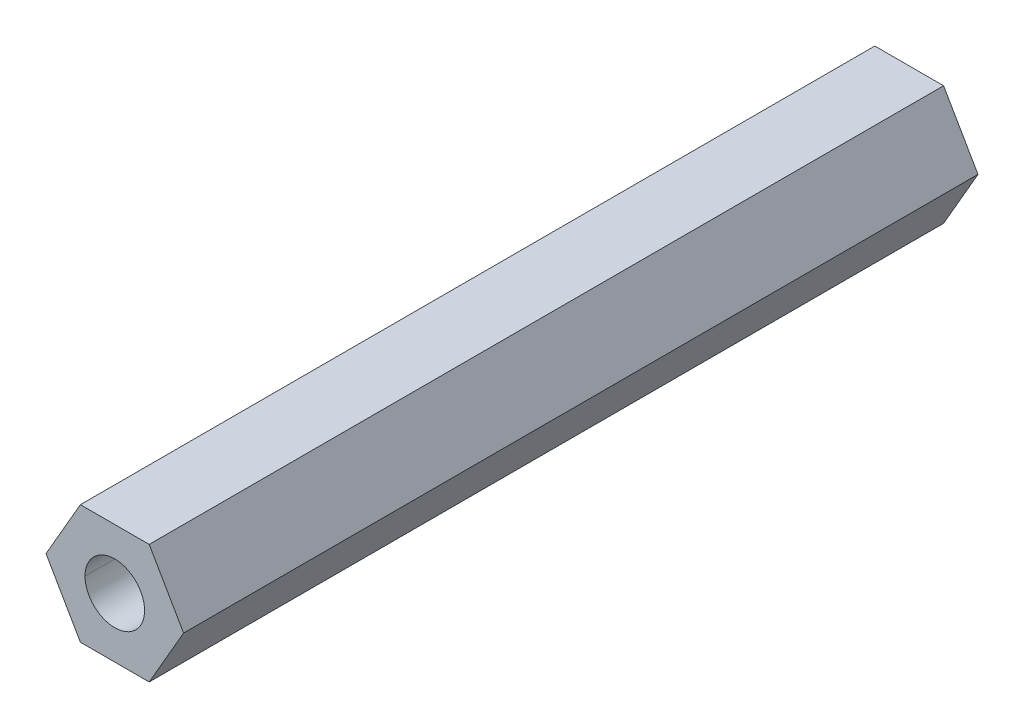
ISO-10303-21;
HEADER;
FILE_DESCRIPTION(('STEP AP214'),'2;1');
FILE_NAME('part.step','',(''),(''),'','','');
FILE_SCHEMA(('AUTOMOTIVE_DESIGN { 1 0 10303 214 1 1 1 1 }'));
ENDSEC;
DATA;
#1=APPLICATION_CONTEXT('core data for automotive mechanical design processes');
#2=APPLICATION_PROTOCOL_DEFINITION('international standard','automotive_design',2000,#1);
#3=PRODUCT_CONTEXT('',#1,'mechanical');
#4=PRODUCT('Part','Part','',(#3));
#5=PRODUCT_RELATED_PRODUCT_CATEGORY('part','',(#4));
#6=PRODUCT_DEFINITION_FORMATION('','',#4);
#7=PRODUCT_DEFINITION_CONTEXT('part definition',#1,'design');
#8=PRODUCT_DEFINITION('design','',#6,#7);
#9=PRODUCT_DEFINITION_SHAPE('','',#8);
#10=(LENGTH_UNIT() NAMED_UNIT(*) SI_UNIT(.MILLI.,.METRE.));
#11=(NAMED_UNIT(*) PLANE_ANGLE_UNIT() SI_UNIT($,.RADIAN.));
#12=(NAMED_UNIT(*) SI_UNIT($,.STERADIAN.) SOLID_ANGLE_UNIT());
#13=UNCERTAINTY_MEASURE_WITH_UNIT(LENGTH_MEASURE(1.E-05),#10,'distance_accuracy_value','');
#14=(GEOMETRIC_REPRESENTATION_CONTEXT(3) GLOBAL_UNCERTAINTY_ASSIGNED_CONTEXT((#13)) GLOBAL_UNIT_ASSIGNED_CONTEXT((#10,
#11,#12)) REPRESENTATION_CONTEXT('',''));
#15=CARTESIAN_POINT('',(0.,0.,0.));
#16=DIRECTION('',(0.,0.,1.));
#17=DIRECTION('',(1.,0.,0.));
#18=AXIS2_PLACEMENT_3D('',#15,#16,#17);
#19=CARTESIAN_POINT('',(1.732050807569,-3.,0.));
#20=DIRECTION('',(0.,0.,1.));
#21=DIRECTION('',(1.,0.,0.));
#22=AXIS2_PLACEMENT_3D('',#19,#20,#21);
#23=CYLINDRICAL_SURFACE('',#22,1.5);
#24=DIRECTION('',(0.,0.,-1.));
#25=VECTOR('',#24,1.);
#26=CARTESIAN_POINT('',(0.2320508075689,-3.,40.));
#27=LINE('',#26,#25);
#28=CARTESIAN_POINT('',(0.2320508075689,-3.,40.));
#29=VERTEX_POINT('',#28);
#30=CARTESIAN_POINT('',(0.2320508075689,-3.,0.));
#31=VERTEX_POINT('',#30);
#32=EDGE_CURVE('E11',#29,#31,#27,.T.);
#33=ORIENTED_EDGE('',*,*,#32,.F.);
#34=CARTESIAN_POINT('',(1.732050807569,-3.,40.));
#35=DIRECTION('',(0.,0.,-1.));
#36=DIRECTION('',(1.,0.,0.));
#37=AXIS2_PLACEMENT_3D('',#34,#35,#36);
#38=CIRCLE('',#37,1.5);
#39=CARTESIAN_POINT('',(3.232050807569,-3.,40.));
#40=VERTEX_POINT('',#39);
#41=EDGE_CURVE('E157',#40,#29,#38,.T.);
#42=ORIENTED_EDGE('',*,*,#41,.F.);
#43=DIRECTION('',(0.,0.,-1.));
#44=VECTOR('',#43,1.);
#45=CARTESIAN_POINT('',(3.232050807569,-3.,40.));
#46=LINE('',#45,#44);
#47=CARTESIAN_POINT('',(3.232050807569,-3.,0.));
#48=VERTEX_POINT('',#47);
#49=EDGE_CURVE('E28',#40,#48,#46,.T.);
#50=ORIENTED_EDGE('',*,*,#49,.T.);
#51=CARTESIAN_POINT('',(1.732050807569,-3.,0.));
#52=DIRECTION('',(0.,0.,1.));
#53=DIRECTION('',(-1.,0.,0.));
#54=AXIS2_PLACEMENT_3D('',#51,#52,#53);
#55=CIRCLE('',#54,1.5);
#56=EDGE_CURVE('E144',#31,#48,#55,.T.);
#57=ORIENTED_EDGE('',*,*,#56,.F.);
#58=EDGE_LOOP('',(#33,#42,#50,#57));
#59=FACE_BOUND('',#58,.T.);
#60=ADVANCED_FACE('F17',(#59),#23,.F.);
#61=CARTESIAN_POINT('',(1.732050807569,-3.,0.));
#62=DIRECTION('',(0.,0.,1.));
#63=DIRECTION('',(1.,0.,0.));
#64=AXIS2_PLACEMENT_3D('',#61,#62,#63);
#65=CYLINDRICAL_SURFACE('',#64,1.5);
#66=CARTESIAN_POINT('',(1.732050807569,-3.,0.));
#67=DIRECTION('',(0.,0.,1.));
#68=DIRECTION('',(1.,0.,0.));
#69=AXIS2_PLACEMENT_3D('',#66,#67,#68);
#70=CIRCLE('',#69,1.5);
#71=EDGE_CURVE('E147',#48,#31,#70,.T.);
#72=ORIENTED_EDGE('',*,*,#71,.F.);
#73=ORIENTED_EDGE('',*,*,#49,.F.);
#74=CARTESIAN_POINT('',(1.732050807569,-3.,40.));
#75=DIRECTION('',(0.,0.,-1.));
#76=DIRECTION('',(-1.,0.,0.));
#77=AXIS2_PLACEMENT_3D('',#74,#75,#76);
#78=CIRCLE('',#77,1.5);
#79=EDGE_CURVE('E153',#29,#40,#78,.T.);
#80=ORIENTED_EDGE('',*,*,#79,.F.);
#81=ORIENTED_EDGE('',*,*,#32,.T.);
#82=EDGE_LOOP('',(#72,#73,#80,#81));
#83=FACE_BOUND('',#82,.T.);
#84=ADVANCED_FACE('F265',(#83),#65,.F.);
#85=CARTESIAN_POINT('',(0.,0.,40.));
#86=DIRECTION('',(0.,0.,-1.));
#87=DIRECTION('',(0.,-1.,0.));
#88=AXIS2_PLACEMENT_3D('',#85,#86,#87);
#89=PLANE('',#88);
#90=ORIENTED_EDGE('',*,*,#41,.T.);
#91=ORIENTED_EDGE('',*,*,#79,.T.);
#92=EDGE_LOOP('',(#90,#91));
#93=FACE_BOUND('',#92,.T.);
#94=DIRECTION('',(0.500000000000017,-0.866025403784429,0.));
#95=VECTOR('',#94,1.);
#96=CARTESIAN_POINT('',(-1.732050807569,-3.,40.));
#97=LINE('',#96,#95);
#98=CARTESIAN_POINT('',(-1.732050807569,-3.,40.));
#99=VERTEX_POINT('',#98);
#100=CARTESIAN_POINT('',(0.,-6.,40.));
#101=VERTEX_POINT('',#100);
#102=EDGE_CURVE('E115',#99,#101,#97,.T.);
#103=ORIENTED_EDGE('',*,*,#102,.T.);
#104=DIRECTION('',(-1.,0.,0.));
#105=VECTOR('',#104,1.);
#106=CARTESIAN_POINT('',(3.464101615138,-6.,40.));
#107=LINE('',#106,#105);
#108=CARTESIAN_POINT('',(3.464101615138,-6.,40.));
#109=VERTEX_POINT('',#108);
#110=EDGE_CURVE('E112',#109,#101,#107,.T.);
#111=ORIENTED_EDGE('',*,*,#110,.F.);
#112=DIRECTION('',(0.500000000000017,0.866025403784429,0.));
#113=VECTOR('',#112,1.);
#114=CARTESIAN_POINT('',(3.464101615138,-6.,40.));
#115=LINE('',#114,#113);
#116=CARTESIAN_POINT('',(5.196152422707,-3.,40.));
#117=VERTEX_POINT('',#116);
#118=EDGE_CURVE('E152',#109,#117,#115,.T.);
#119=ORIENTED_EDGE('',*,*,#118,.T.);
#120=DIRECTION('',(-0.500000000000017,0.866025403784429,0.));
#121=VECTOR('',#120,1.);
#122=CARTESIAN_POINT('',(5.196152422707,-3.,40.));
#123=LINE('',#122,#121);
#124=CARTESIAN_POINT('',(3.464101615138,0.,40.));
#125=VERTEX_POINT('',#124);
#126=EDGE_CURVE('E142',#117,#125,#123,.T.);
#127=ORIENTED_EDGE('',*,*,#126,.T.);
#128=DIRECTION('',(1.,0.,0.));
#129=VECTOR('',#128,1.);
#130=CARTESIAN_POINT('',(0.,0.,40.));
#131=LINE('',#130,#129);
#132=CARTESIAN_POINT('',(0.,0.,40.));
#133=VERTEX_POINT('',#132);
#134=EDGE_CURVE('E183',#133,#125,#131,.T.);
#135=ORIENTED_EDGE('',*,*,#134,.F.);
#136=DIRECTION('',(-0.500000000000017,-0.866025403784429,0.));
#137=VECTOR('',#136,1.);
#138=CARTESIAN_POINT('',(0.,0.,40.));
#139=LINE('',#138,#137);
#140=EDGE_CURVE('E172',#133,#99,#139,.T.);
#141=ORIENTED_EDGE('',*,*,#140,.T.);
#142=EDGE_LOOP('',(#103,#111,#119,#127,#135,#141));
#143=FACE_BOUND('',#142,.T.);
#144=ADVANCED_FACE('F205',(#93,#143),#89,.F.);
#145=CARTESIAN_POINT('',(0.,-6.,40.));
#146=DIRECTION('',(0.866025403784429,0.500000000000017,0.));
#147=DIRECTION('',(0.,0.,-1.));
#148=AXIS2_PLACEMENT_3D('',#145,#146,#147);
#149=PLANE('',#148);
#150=DIRECTION('',(0.,0.,1.));
#151=VECTOR('',#150,1.);
#152=CARTESIAN_POINT('',(0.,-6.,0.));
#153=LINE('',#152,#151);
#154=CARTESIAN_POINT('',(0.,-6.,0.));
#155=VERTEX_POINT('',#154);
#156=EDGE_CURVE('E105',#155,#101,#153,.T.);
#157=ORIENTED_EDGE('',*,*,#156,.T.);
#158=ORIENTED_EDGE('',*,*,#102,.F.);
#159=DIRECTION('',(0.,0.,1.));
#160=VECTOR('',#159,1.);
#161=CARTESIAN_POINT('',(-1.732050807569,-3.,0.));
#162=LINE('',#161,#160);
#163=CARTESIAN_POINT('',(-1.732050807569,-3.,0.));
#164=VERTEX_POINT('',#163);
#165=EDGE_CURVE('E121',#164,#99,#162,.T.);
#166=ORIENTED_EDGE('',*,*,#165,.F.);
#167=DIRECTION('',(-0.500000000000017,0.866025403784429,0.));
#168=VECTOR('',#167,1.);
#169=CARTESIAN_POINT('',(0.,-6.,0.));
#170=LINE('',#169,#168);
#171=EDGE_CURVE('E118',#155,#164,#170,.T.);
#172=ORIENTED_EDGE('',*,*,#171,.F.);
#173=EDGE_LOOP('',(#157,#158,#166,#172));
#174=FACE_BOUND('',#173,.T.);
#175=ADVANCED_FACE('F119',(#174),#149,.F.);
#176=CARTESIAN_POINT('',(3.464101615138,-6.,40.));
#177=DIRECTION('',(0.,1.,0.));
#178=DIRECTION('',(1.,0.,0.));
#179=AXIS2_PLACEMENT_3D('',#176,#177,#178);
#180=PLANE('',#179);
#181=DIRECTION('',(0.,0.,1.));
#182=VECTOR('',#181,1.);
#183=CARTESIAN_POINT('',(3.464101615138,-6.,0.));
#184=LINE('',#183,#182);
#185=CARTESIAN_POINT('',(3.464101615138,-6.,0.));
#186=VERTEX_POINT('',#185);
#187=EDGE_CURVE('E166',#186,#109,#184,.T.);
#188=ORIENTED_EDGE('',*,*,#187,.T.);
#189=ORIENTED_EDGE('',*,*,#110,.T.);
#190=ORIENTED_EDGE('',*,*,#156,.F.);
#191=DIRECTION('',(-1.,0.,0.));
#192=VECTOR('',#191,1.);
#193=CARTESIAN_POINT('',(3.464101615138,-6.,0.));
#194=LINE('',#193,#192);
#195=EDGE_CURVE('E110',#186,#155,#194,.T.);
#196=ORIENTED_EDGE('',*,*,#195,.F.);
#197=EDGE_LOOP('',(#188,#189,#190,#196));
#198=FACE_BOUND('',#197,.T.);
#199=ADVANCED_FACE('F108',(#198),#180,.F.);
#200=CARTESIAN_POINT('',(5.196152422707,-3.,40.));
#201=DIRECTION('',(-0.866025403784429,0.500000000000017,0.));
#202=DIRECTION('',(0.,0.,1.));
#203=AXIS2_PLACEMENT_3D('',#200,#201,#202);
#204=PLANE('',#203);
#205=DIRECTION('',(0.,0.,1.));
#206=VECTOR('',#205,1.);
#207=CARTESIAN_POINT('',(5.196152422707,-3.,0.));
#208=LINE('',#207,#206);
#209=CARTESIAN_POINT('',(5.196152422707,-3.,0.));
#210=VERTEX_POINT('',#209);
#211=EDGE_CURVE('E148',#210,#117,#208,.T.);
#212=ORIENTED_EDGE('',*,*,#211,.T.);
#213=ORIENTED_EDGE('',*,*,#118,.F.);
#214=ORIENTED_EDGE('',*,*,#187,.F.);
#215=DIRECTION('',(-0.500000000000017,-0.866025403784429,0.));
#216=VECTOR('',#215,1.);
#217=CARTESIAN_POINT('',(5.196152422707,-3.,0.));
#218=LINE('',#217,#216);
#219=EDGE_CURVE('E131',#210,#186,#218,.T.);
#220=ORIENTED_EDGE('',*,*,#219,.F.);
#221=EDGE_LOOP('',(#212,#213,#214,#220));
#222=FACE_BOUND('',#221,.T.);
#223=ADVANCED_FACE('F235',(#222),#204,.F.);
#224=CARTESIAN_POINT('',(3.464101615138,0.,40.));
#225=DIRECTION('',(-0.866025403784429,-0.500000000000017,0.));
#226=DIRECTION('',(-0.500000000000017,0.866025403784429,0.));
#227=AXIS2_PLACEMENT_3D('',#224,#225,#226);
#228=PLANE('',#227);
#229=DIRECTION('',(0.,0.,1.));
#230=VECTOR('',#229,1.);
#231=CARTESIAN_POINT('',(3.464101615138,0.,0.));
#232=LINE('',#231,#230);
#233=CARTESIAN_POINT('',(3.464101615138,0.,0.));
#234=VERTEX_POINT('',#233);
#235=EDGE_CURVE('E196',#234,#125,#232,.T.);
#236=ORIENTED_EDGE('',*,*,#235,.T.);
#237=ORIENTED_EDGE('',*,*,#126,.F.);
#238=ORIENTED_EDGE('',*,*,#211,.F.);
#239=DIRECTION('',(0.500000000000017,-0.866025403784429,0.));
#240=VECTOR('',#239,1.);
#241=CARTESIAN_POINT('',(3.464101615138,0.,0.));
#242=LINE('',#241,#240);
#243=EDGE_CURVE('E138',#234,#210,#242,.T.);
#244=ORIENTED_EDGE('',*,*,#243,.F.);
#245=EDGE_LOOP('',(#236,#237,#238,#244));
#246=FACE_BOUND('',#245,.T.);
#247=ADVANCED_FACE('F212',(#246),#228,.F.);
#248=CARTESIAN_POINT('',(0.,0.,40.));
#249=DIRECTION('',(0.,-1.,0.));
#250=DIRECTION('',(0.,0.,-1.));
#251=AXIS2_PLACEMENT_3D('',#248,#249,#250);
#252=PLANE('',#251);
#253=DIRECTION('',(0.,0.,1.));
#254=VECTOR('',#253,1.);
#255=CARTESIAN_POINT('',(0.,0.,0.));
#256=LINE('',#255,#254);
#257=CARTESIAN_POINT('',(0.,0.,0.));
#258=VERTEX_POINT('',#257);
#259=EDGE_CURVE('E175',#258,#133,#256,.T.);
#260=ORIENTED_EDGE('',*,*,#259,.T.);
#261=ORIENTED_EDGE('',*,*,#134,.T.);
#262=ORIENTED_EDGE('',*,*,#235,.F.);
#263=DIRECTION('',(1.,0.,0.));
#264=VECTOR('',#263,1.);
#265=CARTESIAN_POINT('',(0.,0.,0.));
#266=LINE('',#265,#264);
#267=EDGE_CURVE('E161',#258,#234,#266,.T.);
#268=ORIENTED_EDGE('',*,*,#267,.F.);
#269=EDGE_LOOP('',(#260,#261,#262,#268));
#270=FACE_BOUND('',#269,.T.);
#271=ADVANCED_FACE('F202',(#270),#252,.F.);
#272=CARTESIAN_POINT('',(-1.732050807569,-3.,40.));
#273=DIRECTION('',(0.866025403784429,-0.500000000000017,0.));
#274=DIRECTION('',(0.,0.,-1.));
#275=AXIS2_PLACEMENT_3D('',#272,#273,#274);
#276=PLANE('',#275);
#277=ORIENTED_EDGE('',*,*,#165,.T.);
#278=ORIENTED_EDGE('',*,*,#140,.F.);
#279=ORIENTED_EDGE('',*,*,#259,.F.);
#280=DIRECTION('',(0.500000000000017,0.866025403784429,0.));
#281=VECTOR('',#280,1.);
#282=CARTESIAN_POINT('',(-1.732050807569,-3.,0.));
#283=LINE('',#282,#281);
#284=EDGE_CURVE('E21',#164,#258,#283,.T.);
#285=ORIENTED_EDGE('',*,*,#284,.F.);
#286=EDGE_LOOP('',(#277,#278,#279,#285));
#287=FACE_BOUND('',#286,.T.);
#288=ADVANCED_FACE('F19',(#287),#276,.F.);
#289=CARTESIAN_POINT('',(0.,0.,0.));
#290=DIRECTION('',(0.,0.,-1.));
#291=DIRECTION('',(0.,-1.,0.));
#292=AXIS2_PLACEMENT_3D('',#289,#290,#291);
#293=PLANE('',#292);
#294=ORIENTED_EDGE('',*,*,#56,.T.);
#295=ORIENTED_EDGE('',*,*,#71,.T.);
#296=EDGE_LOOP('',(#294,#295));
#297=FACE_BOUND('',#296,.T.);
#298=ORIENTED_EDGE('',*,*,#267,.T.);
#299=ORIENTED_EDGE('',*,*,#243,.T.);
#300=ORIENTED_EDGE('',*,*,#219,.T.);
#301=ORIENTED_EDGE('',*,*,#195,.T.);
#302=ORIENTED_EDGE('',*,*,#171,.T.);
#303=ORIENTED_EDGE('',*,*,#284,.T.);
#304=EDGE_LOOP('',(#298,#299,#300,#301,#302,#303));
#305=FACE_BOUND('',#304,.T.);
#306=ADVANCED_FACE('F128',(#297,#305),#293,.T.);
#307=CLOSED_SHELL('',(#60,#84,#144,#175,#199,#223,#247,#271,#288,#306));
#308=MANIFOLD_SOLID_BREP('B1',#307);
#309=ADVANCED_BREP_SHAPE_REPRESENTATION('',(#18,#308),#14);
#310=SHAPE_DEFINITION_REPRESENTATION(#9,#309);
ENDSEC;
END-ISO-10303-21;
